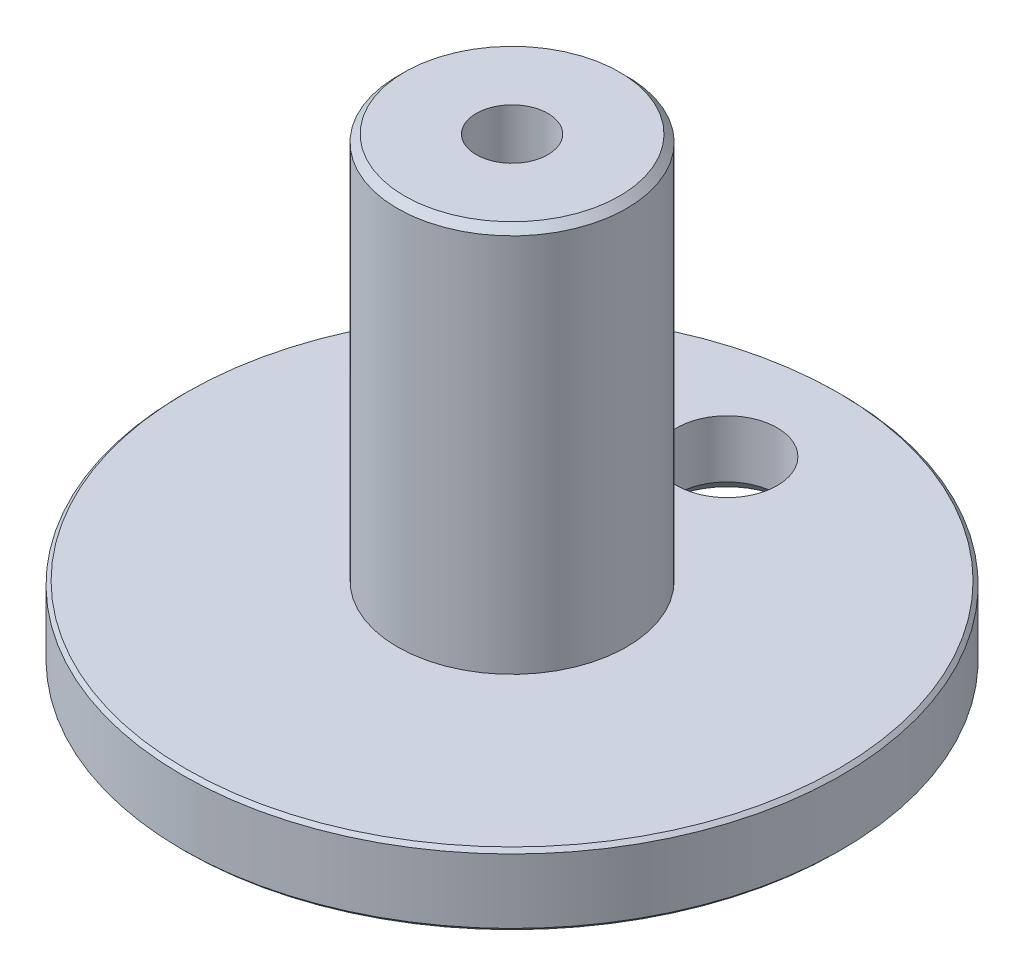
ISO-10303-21;
HEADER;
FILE_DESCRIPTION(('STEP AP214'),'2;1');
FILE_NAME('part.step','',(''),(''),'','','');
FILE_SCHEMA(('AUTOMOTIVE_DESIGN { 1 0 10303 214 1 1 1 1 }'));
ENDSEC;
DATA;
#1=APPLICATION_CONTEXT('core data for automotive mechanical design processes');
#2=APPLICATION_PROTOCOL_DEFINITION('international standard','automotive_design',2000,#1);
#3=PRODUCT_CONTEXT('',#1,'mechanical');
#4=PRODUCT('Part','Part','',(#3));
#5=PRODUCT_RELATED_PRODUCT_CATEGORY('part','',(#4));
#6=PRODUCT_DEFINITION_FORMATION('','',#4);
#7=PRODUCT_DEFINITION_CONTEXT('part definition',#1,'design');
#8=PRODUCT_DEFINITION('design','',#6,#7);
#9=PRODUCT_DEFINITION_SHAPE('','',#8);
#10=(LENGTH_UNIT() NAMED_UNIT(*) SI_UNIT(.MILLI.,.METRE.));
#11=(NAMED_UNIT(*) PLANE_ANGLE_UNIT() SI_UNIT($,.RADIAN.));
#12=(NAMED_UNIT(*) SI_UNIT($,.STERADIAN.) SOLID_ANGLE_UNIT());
#13=UNCERTAINTY_MEASURE_WITH_UNIT(LENGTH_MEASURE(1.E-05),#10,'distance_accuracy_value','');
#14=(GEOMETRIC_REPRESENTATION_CONTEXT(3) GLOBAL_UNCERTAINTY_ASSIGNED_CONTEXT((#13)) GLOBAL_UNIT_ASSIGNED_CONTEXT((#10,
#11,#12)) REPRESENTATION_CONTEXT('',''));
#15=CARTESIAN_POINT('',(0.,0.,0.));
#16=DIRECTION('',(0.,0.,1.));
#17=DIRECTION('',(1.,0.,0.));
#18=AXIS2_PLACEMENT_3D('',#15,#16,#17);
#19=CARTESIAN_POINT('',(0.,5.,0.));
#20=DIRECTION('',(0.,-1.,0.));
#21=DIRECTION('',(0.,0.,-1.));
#22=AXIS2_PLACEMENT_3D('',#19,#20,#21);
#23=CYLINDRICAL_SURFACE('',#22,23.);
#24=CARTESIAN_POINT('',(0.,0.25,0.));
#25=DIRECTION('',(0.,1.,0.));
#26=DIRECTION('',(0.,0.,1.));
#27=AXIS2_PLACEMENT_3D('',#24,#25,#26);
#28=CIRCLE('',#27,23.);
#29=CARTESIAN_POINT('',(0.,0.25,23.));
#30=VERTEX_POINT('',#29);
#31=EDGE_CURVE('E61',#30,#30,#28,.T.);
#32=ORIENTED_EDGE('',*,*,#31,.T.);
#33=EDGE_LOOP('',(#32));
#34=FACE_BOUND('',#33,.T.);
#35=CARTESIAN_POINT('',(0.,4.75,0.));
#36=DIRECTION('',(0.,1.,0.));
#37=DIRECTION('',(0.,0.,1.));
#38=AXIS2_PLACEMENT_3D('',#35,#36,#37);
#39=CIRCLE('',#38,23.);
#40=CARTESIAN_POINT('',(0.,4.75,23.));
#41=VERTEX_POINT('',#40);
#42=EDGE_CURVE('E64',#41,#41,#39,.F.);
#43=ORIENTED_EDGE('',*,*,#42,.T.);
#44=EDGE_LOOP('',(#43));
#45=FACE_BOUND('',#44,.T.);
#46=ADVANCED_FACE('F40',(#34,#45),#23,.T.);
#47=CARTESIAN_POINT('',(0.,5.,-15.));
#48=DIRECTION('',(0.,-1.,0.));
#49=DIRECTION('',(0.,0.,-1.));
#50=AXIS2_PLACEMENT_3D('',#47,#48,#49);
#51=CYLINDRICAL_SURFACE('',#50,3.5);
#52=CARTESIAN_POINT('',(0.,1.00000000000002,-15.));
#53=DIRECTION('',(0.,1.,0.));
#54=DIRECTION('',(0.,0.,1.));
#55=AXIS2_PLACEMENT_3D('',#52,#53,#54);
#56=CIRCLE('',#55,3.5);
#57=CARTESIAN_POINT('',(0.,1.00000000000002,-11.5));
#58=VERTEX_POINT('',#57);
#59=EDGE_CURVE('E10',#58,#58,#56,.F.);
#60=ORIENTED_EDGE('',*,*,#59,.T.);
#61=EDGE_LOOP('',(#60));
#62=FACE_BOUND('',#61,.T.);
#63=CARTESIAN_POINT('',(0.,5.,-15.));
#64=DIRECTION('',(0.,1.,0.));
#65=DIRECTION('',(0.,0.,1.));
#66=AXIS2_PLACEMENT_3D('',#63,#64,#65);
#67=CIRCLE('',#66,3.5);
#68=CARTESIAN_POINT('',(0.,5.,-11.5));
#69=VERTEX_POINT('',#68);
#70=EDGE_CURVE('E73',#69,#69,#67,.T.);
#71=ORIENTED_EDGE('',*,*,#70,.T.);
#72=EDGE_LOOP('',(#71));
#73=FACE_BOUND('',#72,.T.);
#74=ADVANCED_FACE('F105',(#62,#73),#51,.F.);
#75=CARTESIAN_POINT('',(0.,5.,0.));
#76=DIRECTION('',(0.,-1.,0.));
#77=DIRECTION('',(0.,0.,-1.));
#78=AXIS2_PLACEMENT_3D('',#75,#76,#77);
#79=CYLINDRICAL_SURFACE('',#78,2.5);
#80=CARTESIAN_POINT('',(0.,0.,0.));
#81=DIRECTION('',(0.,1.,0.));
#82=DIRECTION('',(0.,0.,1.));
#83=AXIS2_PLACEMENT_3D('',#80,#81,#82);
#84=CIRCLE('',#83,2.5);
#85=CARTESIAN_POINT('',(0.,0.,2.5));
#86=VERTEX_POINT('',#85);
#87=EDGE_CURVE('E74',#86,#86,#84,.T.);
#88=ORIENTED_EDGE('',*,*,#87,.F.);
#89=EDGE_LOOP('',(#88));
#90=FACE_BOUND('',#89,.T.);
#91=CARTESIAN_POINT('',(0.,32.,0.));
#92=DIRECTION('',(0.,1.,0.));
#93=DIRECTION('',(0.,0.,1.));
#94=AXIS2_PLACEMENT_3D('',#91,#92,#93);
#95=CIRCLE('',#94,2.5);
#96=CARTESIAN_POINT('',(0.,32.,2.5));
#97=VERTEX_POINT('',#96);
#98=EDGE_CURVE('E82',#97,#97,#95,.T.);
#99=ORIENTED_EDGE('',*,*,#98,.T.);
#100=EDGE_LOOP('',(#99));
#101=FACE_BOUND('',#100,.T.);
#102=ADVANCED_FACE('F86',(#90,#101),#79,.F.);
#103=CARTESIAN_POINT('',(0.,5.,0.));
#104=DIRECTION('',(0.,1.,0.));
#105=DIRECTION('',(0.,0.,1.));
#106=AXIS2_PLACEMENT_3D('',#103,#104,#105);
#107=PLANE('',#106);
#108=CARTESIAN_POINT('',(0.,5.,0.));
#109=DIRECTION('',(0.,1.,0.));
#110=DIRECTION('',(0.,0.,1.));
#111=AXIS2_PLACEMENT_3D('',#108,#109,#110);
#112=CIRCLE('',#111,22.75);
#113=CARTESIAN_POINT('',(0.,5.,22.75));
#114=VERTEX_POINT('',#113);
#115=EDGE_CURVE('E52',#114,#114,#112,.T.);
#116=ORIENTED_EDGE('',*,*,#115,.T.);
#117=EDGE_LOOP('',(#116));
#118=FACE_BOUND('',#117,.T.);
#119=CARTESIAN_POINT('',(0.,5.,0.));
#120=DIRECTION('',(0.,1.,0.));
#121=DIRECTION('',(0.,0.,1.));
#122=AXIS2_PLACEMENT_3D('',#119,#120,#121);
#123=CIRCLE('',#122,8.);
#124=CARTESIAN_POINT('',(0.,5.,8.));
#125=VERTEX_POINT('',#124);
#126=EDGE_CURVE('E77',#125,#125,#123,.F.);
#127=ORIENTED_EDGE('',*,*,#126,.T.);
#128=EDGE_LOOP('',(#127));
#129=FACE_BOUND('',#128,.T.);
#130=ORIENTED_EDGE('',*,*,#70,.F.);
#131=EDGE_LOOP('',(#130));
#132=FACE_BOUND('',#131,.T.);
#133=ADVANCED_FACE('F138',(#118,#129,#132),#107,.T.);
#134=CARTESIAN_POINT('',(0.,0.,0.));
#135=DIRECTION('',(0.,1.,0.));
#136=DIRECTION('',(0.,0.,1.));
#137=AXIS2_PLACEMENT_3D('',#134,#135,#136);
#138=PLANE('',#137);
#139=CARTESIAN_POINT('',(0.,0.,-15.));
#140=DIRECTION('',(0.,1.,0.));
#141=DIRECTION('',(0.,0.,1.));
#142=AXIS2_PLACEMENT_3D('',#139,#140,#141);
#143=CIRCLE('',#142,4.50000000000002);
#144=CARTESIAN_POINT('',(0.,0.,-10.5));
#145=VERTEX_POINT('',#144);
#146=EDGE_CURVE('E48',#145,#145,#143,.T.);
#147=ORIENTED_EDGE('',*,*,#146,.T.);
#148=EDGE_LOOP('',(#147));
#149=FACE_BOUND('',#148,.T.);
#150=CARTESIAN_POINT('',(0.,0.,0.));
#151=DIRECTION('',(0.,1.,0.));
#152=DIRECTION('',(0.,0.,1.));
#153=AXIS2_PLACEMENT_3D('',#150,#151,#152);
#154=CIRCLE('',#153,22.75);
#155=CARTESIAN_POINT('',(0.,0.,22.75));
#156=VERTEX_POINT('',#155);
#157=EDGE_CURVE('E56',#156,#156,#154,.F.);
#158=ORIENTED_EDGE('',*,*,#157,.T.);
#159=EDGE_LOOP('',(#158));
#160=FACE_BOUND('',#159,.T.);
#161=ORIENTED_EDGE('',*,*,#87,.T.);
#162=EDGE_LOOP('',(#161));
#163=FACE_BOUND('',#162,.T.);
#164=ADVANCED_FACE('F101',(#149,#160,#163),#138,.F.);
#165=CARTESIAN_POINT('',(0.,32.,0.));
#166=DIRECTION('',(0.,-1.,0.));
#167=DIRECTION('',(0.,0.,-1.));
#168=AXIS2_PLACEMENT_3D('',#165,#166,#167);
#169=CYLINDRICAL_SURFACE('',#168,8.);
#170=CARTESIAN_POINT('',(0.,31.5,0.));
#171=DIRECTION('',(0.,1.,0.));
#172=DIRECTION('',(0.,0.,1.));
#173=AXIS2_PLACEMENT_3D('',#170,#171,#172);
#174=CIRCLE('',#173,8.);
#175=CARTESIAN_POINT('',(0.,31.5,8.));
#176=VERTEX_POINT('',#175);
#177=EDGE_CURVE('E67',#176,#176,#174,.F.);
#178=ORIENTED_EDGE('',*,*,#177,.T.);
#179=EDGE_LOOP('',(#178));
#180=FACE_BOUND('',#179,.T.);
#181=ORIENTED_EDGE('',*,*,#126,.F.);
#182=EDGE_LOOP('',(#181));
#183=FACE_BOUND('',#182,.T.);
#184=ADVANCED_FACE('F91',(#180,#183),#169,.T.);
#185=CARTESIAN_POINT('',(0.,32.,0.));
#186=DIRECTION('',(0.,1.,0.));
#187=DIRECTION('',(0.,0.,1.));
#188=AXIS2_PLACEMENT_3D('',#185,#186,#187);
#189=PLANE('',#188);
#190=CARTESIAN_POINT('',(0.,32.,0.));
#191=DIRECTION('',(0.,1.,0.));
#192=DIRECTION('',(0.,0.,1.));
#193=AXIS2_PLACEMENT_3D('',#190,#191,#192);
#194=CIRCLE('',#193,7.49999999999999);
#195=CARTESIAN_POINT('',(0.,32.,7.49999999999999));
#196=VERTEX_POINT('',#195);
#197=EDGE_CURVE('E70',#196,#196,#194,.T.);
#198=ORIENTED_EDGE('',*,*,#197,.T.);
#199=EDGE_LOOP('',(#198));
#200=FACE_BOUND('',#199,.T.);
#201=ORIENTED_EDGE('',*,*,#98,.F.);
#202=EDGE_LOOP('',(#201));
#203=FACE_BOUND('',#202,.T.);
#204=ADVANCED_FACE('F88',(#200,#203),#189,.T.);
#205=CARTESIAN_POINT('',(0.,32.,0.));
#206=DIRECTION('',(0.,-1.,0.));
#207=DIRECTION('',(0.,0.,-1.));
#208=AXIS2_PLACEMENT_3D('',#205,#206,#207);
#209=CONICAL_SURFACE('',#208,7.49999999999999,0.785398163397455);
#210=ORIENTED_EDGE('',*,*,#177,.F.);
#211=EDGE_LOOP('',(#210));
#212=FACE_BOUND('',#211,.T.);
#213=ORIENTED_EDGE('',*,*,#197,.F.);
#214=EDGE_LOOP('',(#213));
#215=FACE_BOUND('',#214,.T.);
#216=ADVANCED_FACE('F90',(#212,#215),#209,.T.);
#217=CARTESIAN_POINT('',(0.,0.25,0.));
#218=DIRECTION('',(0.,1.,0.));
#219=DIRECTION('',(0.,0.,1.));
#220=AXIS2_PLACEMENT_3D('',#217,#218,#219);
#221=CONICAL_SURFACE('',#220,23.,0.785398163397441);
#222=ORIENTED_EDGE('',*,*,#157,.F.);
#223=EDGE_LOOP('',(#222));
#224=FACE_BOUND('',#223,.T.);
#225=ORIENTED_EDGE('',*,*,#31,.F.);
#226=EDGE_LOOP('',(#225));
#227=FACE_BOUND('',#226,.T.);
#228=ADVANCED_FACE('F98',(#224,#227),#221,.T.);
#229=CARTESIAN_POINT('',(0.,5.,0.));
#230=DIRECTION('',(0.,-1.,0.));
#231=DIRECTION('',(0.,0.,-1.));
#232=AXIS2_PLACEMENT_3D('',#229,#230,#231);
#233=CONICAL_SURFACE('',#232,22.75,0.785398163397462);
#234=ORIENTED_EDGE('',*,*,#42,.F.);
#235=EDGE_LOOP('',(#234));
#236=FACE_BOUND('',#235,.T.);
#237=ORIENTED_EDGE('',*,*,#115,.F.);
#238=EDGE_LOOP('',(#237));
#239=FACE_BOUND('',#238,.T.);
#240=ADVANCED_FACE('F124',(#236,#239),#233,.T.);
#241=CARTESIAN_POINT('',(0.,0.,-15.));
#242=DIRECTION('',(0.,-1.,0.));
#243=DIRECTION('',(0.,0.,-1.));
#244=AXIS2_PLACEMENT_3D('',#241,#242,#243);
#245=CONICAL_SURFACE('',#244,4.50000000000002,0.785398163397447);
#246=ORIENTED_EDGE('',*,*,#59,.F.);
#247=EDGE_LOOP('',(#246));
#248=FACE_BOUND('',#247,.T.);
#249=ORIENTED_EDGE('',*,*,#146,.F.);
#250=EDGE_LOOP('',(#249));
#251=FACE_BOUND('',#250,.T.);
#252=ADVANCED_FACE('F43',(#248,#251),#245,.F.);
#253=CLOSED_SHELL('',(#46,#74,#102,#133,#164,#184,#204,#216,#228,#240,#252));
#254=MANIFOLD_SOLID_BREP('B2',#253);
#255=ADVANCED_BREP_SHAPE_REPRESENTATION('',(#18,#254),#14);
#256=SHAPE_DEFINITION_REPRESENTATION(#9,#255);
ENDSEC;
END-ISO-10303-21;
